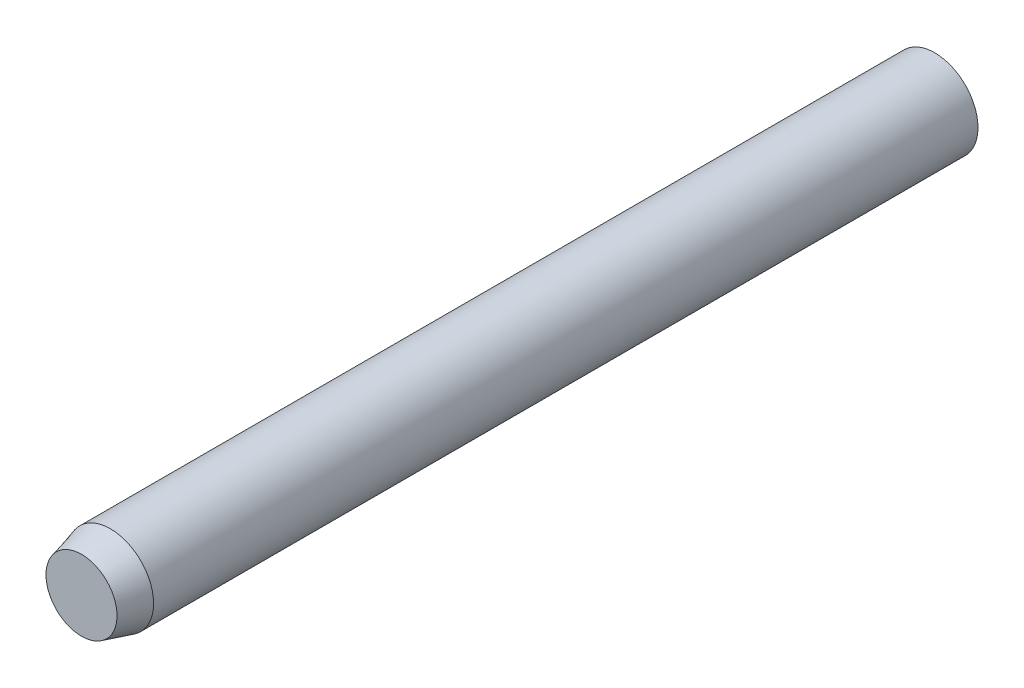
ISO-10303-21;
HEADER;
FILE_DESCRIPTION(('STEP AP214'),'2;1');
FILE_NAME('part.step','',(''),(''),'','','');
FILE_SCHEMA(('AUTOMOTIVE_DESIGN { 1 0 10303 214 1 1 1 1 }'));
ENDSEC;
DATA;
#1=APPLICATION_CONTEXT('core data for automotive mechanical design processes');
#2=APPLICATION_PROTOCOL_DEFINITION('international standard','automotive_design',2000,#1);
#3=PRODUCT_CONTEXT('',#1,'mechanical');
#4=PRODUCT('Part','Part','',(#3));
#5=PRODUCT_RELATED_PRODUCT_CATEGORY('part','',(#4));
#6=PRODUCT_DEFINITION_FORMATION('','',#4);
#7=PRODUCT_DEFINITION_CONTEXT('part definition',#1,'design');
#8=PRODUCT_DEFINITION('design','',#6,#7);
#9=PRODUCT_DEFINITION_SHAPE('','',#8);
#10=(LENGTH_UNIT() NAMED_UNIT(*) SI_UNIT(.MILLI.,.METRE.));
#11=(NAMED_UNIT(*) PLANE_ANGLE_UNIT() SI_UNIT($,.RADIAN.));
#12=(NAMED_UNIT(*) SI_UNIT($,.STERADIAN.) SOLID_ANGLE_UNIT());
#13=UNCERTAINTY_MEASURE_WITH_UNIT(LENGTH_MEASURE(1.E-05),#10,'distance_accuracy_value','');
#14=(GEOMETRIC_REPRESENTATION_CONTEXT(3) GLOBAL_UNCERTAINTY_ASSIGNED_CONTEXT((#13)) GLOBAL_UNIT_ASSIGNED_CONTEXT((#10,
#11,#12)) REPRESENTATION_CONTEXT('',''));
#15=CARTESIAN_POINT('',(0.,0.,0.));
#16=DIRECTION('',(0.,0.,1.));
#17=DIRECTION('',(1.,0.,0.));
#18=AXIS2_PLACEMENT_3D('',#15,#16,#17);
#19=CARTESIAN_POINT('',(0.,1.5,0.));
#20=DIRECTION('',(0.,0.,1.));
#21=DIRECTION('',(1.,0.,0.));
#22=AXIS2_PLACEMENT_3D('',#19,#20,#21);
#23=PLANE('',#22);
#24=CARTESIAN_POINT('',(0.,0.,-5.6843418860808E-11));
#25=DIRECTION('',(0.,0.,-1.));
#26=DIRECTION('',(-1.,0.,0.));
#27=AXIS2_PLACEMENT_3D('',#24,#25,#26);
#28=CIRCLE('',#27,2.46410161517678);
#29=CARTESIAN_POINT('',(-2.46410161517678,0.,-5.6843418860808E-11));
#30=VERTEX_POINT('',#29);
#31=EDGE_CURVE('E17',#30,#30,#28,.T.);
#32=ORIENTED_EDGE('',*,*,#31,.F.);
#33=EDGE_LOOP('',(#32));
#34=FACE_BOUND('',#33,.T.);
#35=ADVANCED_FACE('F14',(#34),#23,.T.);
#36=CARTESIAN_POINT('',(0.,0.,-54.));
#37=DIRECTION('',(0.,1.,0.));
#38=DIRECTION('',(0.,0.,1.));
#39=AXIS2_PLACEMENT_3D('',#36,#37,#38);
#40=SPHERICAL_SURFACE('',#39,6.);
#41=CARTESIAN_POINT('',(0.,0.,-59.1961524227066));
#42=DIRECTION('',(0.,0.,1.));
#43=DIRECTION('',(1.,0.,0.));
#44=AXIS2_PLACEMENT_3D('',#41,#42,#43);
#45=CIRCLE('',#44,3.);
#46=CARTESIAN_POINT('',(3.,0.,-59.1961524227066));
#47=VERTEX_POINT('',#46);
#48=EDGE_CURVE('E21',#47,#47,#45,.T.);
#49=ORIENTED_EDGE('',*,*,#48,.F.);
#50=EDGE_LOOP('',(#49));
#51=FACE_BOUND('',#50,.T.);
#52=ADVANCED_FACE('F30',(#51),#40,.T.);
#53=CARTESIAN_POINT('',(0.,0.,-1.99999999995271));
#54=DIRECTION('',(0.,0.,-1.));
#55=DIRECTION('',(-1.,0.,0.));
#56=AXIS2_PLACEMENT_3D('',#53,#54,#55);
#57=CONICAL_SURFACE('',#56,2.9999999999859,0.261799387787384);
#58=ORIENTED_EDGE('',*,*,#31,.T.);
#59=EDGE_LOOP('',(#58));
#60=FACE_BOUND('',#59,.T.);
#61=CARTESIAN_POINT('',(0.,0.,-2.));
#62=DIRECTION('',(0.,0.,1.));
#63=DIRECTION('',(1.,0.,0.));
#64=AXIS2_PLACEMENT_3D('',#61,#62,#63);
#65=CIRCLE('',#64,3.);
#66=CARTESIAN_POINT('',(3.,0.,-2.));
#67=VERTEX_POINT('',#66);
#68=EDGE_CURVE('E9',#67,#67,#65,.F.);
#69=ORIENTED_EDGE('',*,*,#68,.F.);
#70=EDGE_LOOP('',(#69));
#71=FACE_BOUND('',#70,.T.);
#72=ADVANCED_FACE('F33',(#60,#71),#57,.T.);
#73=CARTESIAN_POINT('',(0.,0.,-29.5980762113533));
#74=DIRECTION('',(0.,0.,1.));
#75=DIRECTION('',(1.,0.,0.));
#76=AXIS2_PLACEMENT_3D('',#73,#74,#75);
#77=CYLINDRICAL_SURFACE('',#76,3.);
#78=ORIENTED_EDGE('',*,*,#68,.T.);
#79=EDGE_LOOP('',(#78));
#80=FACE_BOUND('',#79,.T.);
#81=ORIENTED_EDGE('',*,*,#48,.T.);
#82=EDGE_LOOP('',(#81));
#83=FACE_BOUND('',#82,.T.);
#84=ADVANCED_FACE('F37',(#80,#83),#77,.T.);
#85=CLOSED_SHELL('',(#35,#52,#72,#84));
#86=MANIFOLD_SOLID_BREP('B1',#85);
#87=ADVANCED_BREP_SHAPE_REPRESENTATION('',(#18,#86),#14);
#88=SHAPE_DEFINITION_REPRESENTATION(#9,#87);
ENDSEC;
END-ISO-10303-21;
